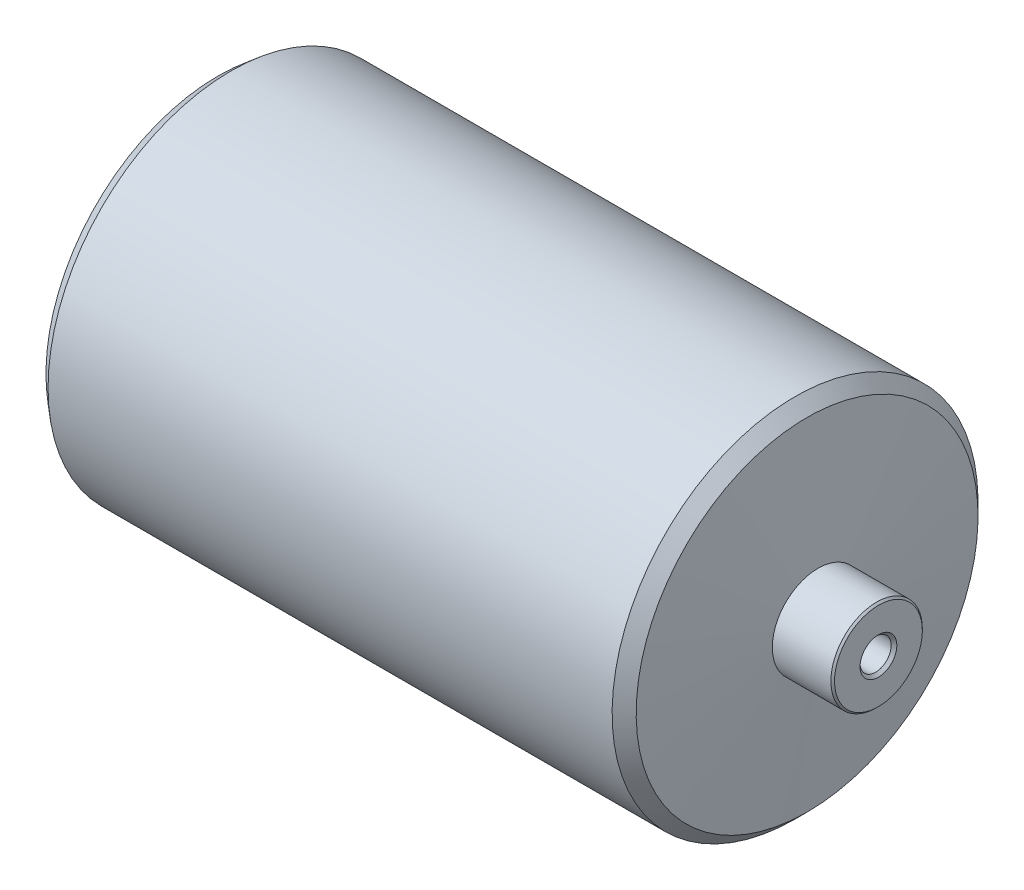
ISO-10303-21;
HEADER;
FILE_DESCRIPTION(('STEP AP214'),'2;1');
FILE_NAME('part.step','',(''),(''),'','','');
FILE_SCHEMA(('AUTOMOTIVE_DESIGN { 1 0 10303 214 1 1 1 1 }'));
ENDSEC;
DATA;
#1=APPLICATION_CONTEXT('core data for automotive mechanical design processes');
#2=APPLICATION_PROTOCOL_DEFINITION('international standard','automotive_design',2000,#1);
#3=PRODUCT_CONTEXT('',#1,'mechanical');
#4=PRODUCT('Part','Part','',(#3));
#5=PRODUCT_RELATED_PRODUCT_CATEGORY('part','',(#4));
#6=PRODUCT_DEFINITION_FORMATION('','',#4);
#7=PRODUCT_DEFINITION_CONTEXT('part definition',#1,'design');
#8=PRODUCT_DEFINITION('design','',#6,#7);
#9=PRODUCT_DEFINITION_SHAPE('','',#8);
#10=(LENGTH_UNIT() NAMED_UNIT(*) SI_UNIT(.MILLI.,.METRE.));
#11=(NAMED_UNIT(*) PLANE_ANGLE_UNIT() SI_UNIT($,.RADIAN.));
#12=(NAMED_UNIT(*) SI_UNIT($,.STERADIAN.) SOLID_ANGLE_UNIT());
#13=UNCERTAINTY_MEASURE_WITH_UNIT(LENGTH_MEASURE(1.E-05),#10,'distance_accuracy_value','');
#14=(GEOMETRIC_REPRESENTATION_CONTEXT(3) GLOBAL_UNCERTAINTY_ASSIGNED_CONTEXT((#13)) GLOBAL_UNIT_ASSIGNED_CONTEXT((#10,
#11,#12)) REPRESENTATION_CONTEXT('',''));
#15=CARTESIAN_POINT('',(0.,0.,0.));
#16=DIRECTION('',(0.,0.,1.));
#17=DIRECTION('',(1.,0.,0.));
#18=AXIS2_PLACEMENT_3D('',#15,#16,#17);
#19=CARTESIAN_POINT('',(-100.,0.,0.));
#20=DIRECTION('',(-1.,0.,0.));
#21=DIRECTION('',(0.,-1.,0.));
#22=AXIS2_PLACEMENT_3D('',#19,#20,#21);
#23=PLANE('',#22);
#24=CARTESIAN_POINT('',(-100.,0.,0.));
#25=DIRECTION('',(-1.,0.,0.));
#26=DIRECTION('',(0.,0.,1.));
#27=AXIS2_PLACEMENT_3D('',#24,#25,#26);
#28=CIRCLE('',#27,5.025);
#29=CARTESIAN_POINT('',(-100.,0.,5.025));
#30=VERTEX_POINT('',#29);
#31=EDGE_CURVE('E83',#30,#30,#28,.T.);
#32=ORIENTED_EDGE('',*,*,#31,.F.);
#33=EDGE_LOOP('',(#32));
#34=FACE_BOUND('',#33,.T.);
#35=CARTESIAN_POINT('',(-100.,0.,0.));
#36=DIRECTION('',(-1.,0.,0.));
#37=DIRECTION('',(0.,-1.,0.));
#38=AXIS2_PLACEMENT_3D('',#35,#36,#37);
#39=CIRCLE('',#38,12.);
#40=CARTESIAN_POINT('',(-100.,-12.,0.));
#41=VERTEX_POINT('',#40);
#42=EDGE_CURVE('E106',#41,#41,#39,.T.);
#43=ORIENTED_EDGE('',*,*,#42,.T.);
#44=EDGE_LOOP('',(#43));
#45=FACE_BOUND('',#44,.T.);
#46=ADVANCED_FACE('F47',(#34,#45),#23,.T.);
#47=CARTESIAN_POINT('',(100.,0.,0.));
#48=DIRECTION('',(1.,0.,0.));
#49=DIRECTION('',(0.,1.,0.));
#50=AXIS2_PLACEMENT_3D('',#47,#48,#49);
#51=CYLINDRICAL_SURFACE('',#50,12.5);
#52=CARTESIAN_POINT('',(-99.4999999999999,0.,0.));
#53=DIRECTION('',(-1.,0.,0.));
#54=DIRECTION('',(0.,-1.,0.));
#55=AXIS2_PLACEMENT_3D('',#52,#53,#54);
#56=CIRCLE('',#55,12.5);
#57=CARTESIAN_POINT('',(-99.4999999999999,-12.5000000000001,0.));
#58=VERTEX_POINT('',#57);
#59=EDGE_CURVE('E102',#58,#58,#56,.F.);
#60=ORIENTED_EDGE('',*,*,#59,.T.);
#61=EDGE_LOOP('',(#60));
#62=FACE_BOUND('',#61,.T.);
#63=CARTESIAN_POINT('',(-83.5,0.,0.));
#64=DIRECTION('',(1.,0.,0.));
#65=DIRECTION('',(0.,1.,0.));
#66=AXIS2_PLACEMENT_3D('',#63,#64,#65);
#67=CIRCLE('',#66,12.5);
#68=CARTESIAN_POINT('',(-83.5,12.4999999999999,0.));
#69=VERTEX_POINT('',#68);
#70=EDGE_CURVE('E98',#69,#69,#67,.T.);
#71=ORIENTED_EDGE('',*,*,#70,.F.);
#72=EDGE_LOOP('',(#71));
#73=FACE_BOUND('',#72,.T.);
#74=ADVANCED_FACE('F145',(#62,#73),#51,.T.);
#75=CARTESIAN_POINT('',(-80.219175117778,0.,0.));
#76=DIRECTION('',(1.,0.,0.));
#77=DIRECTION('',(0.,1.,0.));
#78=AXIS2_PLACEMENT_3D('',#75,#76,#77);
#79=CONICAL_SURFACE('',#78,50.,1.48352986419518);
#80=CARTESIAN_POINT('',(-80.480642346021,0.,0.));
#81=DIRECTION('',(-1.,0.,0.));
#82=DIRECTION('',(0.,-1.,0.));
#83=AXIS2_PLACEMENT_3D('',#80,#81,#82);
#84=CIRCLE('',#83,47.0114159057248);
#85=CARTESIAN_POINT('',(-80.480642346021,47.0114159057246,0.));
#86=VERTEX_POINT('',#85);
#87=EDGE_CURVE('E114',#86,#86,#84,.T.);
#88=CARTESIAN_POINT('',(-80.480642346021,47.0114159057246,0.));
#89=CARTESIAN_POINT('',(-80.5120939882499,46.65192199004,0.));
#90=CARTESIAN_POINT('',(-80.5435456304789,46.2924280743554,0.));
#91=CARTESIAN_POINT('',(-80.6064489149368,45.5734402429861,0.));
#92=CARTESIAN_POINT('',(-80.6379005571657,45.2139463273015,0.));
#93=CARTESIAN_POINT('',(-80.7008038416236,44.4949584959322,0.));
#94=CARTESIAN_POINT('',(-80.7322554838526,44.1354645802476,0.));
#95=CARTESIAN_POINT('',(-80.7951587683105,43.4164767488783,0.));
#96=CARTESIAN_POINT('',(-80.8266104105394,43.0569828331937,0.));
#97=CARTESIAN_POINT('',(-80.8895136949973,42.3379950018244,0.));
#98=CARTESIAN_POINT('',(-80.9209653372263,41.9785010861398,0.));
#99=CARTESIAN_POINT('',(-80.9838686216842,41.2595132547705,0.));
#100=CARTESIAN_POINT('',(-81.0153202639131,40.9000193390859,0.));
#101=CARTESIAN_POINT('',(-81.078223548371,40.1810315077166,0.));
#102=CARTESIAN_POINT('',(-81.1096751905999,39.821537592032,0.));
#103=CARTESIAN_POINT('',(-81.1725784750578,39.1025497606627,0.));
#104=CARTESIAN_POINT('',(-81.2040301172868,38.7430558449781,0.));
#105=CARTESIAN_POINT('',(-81.2669334017447,38.0240680136088,0.));
#106=CARTESIAN_POINT('',(-81.2983850439736,37.6645740979242,0.));
#107=CARTESIAN_POINT('',(-81.3612883284316,36.9455862665549,0.));
#108=CARTESIAN_POINT('',(-81.3927399706605,36.5860923508703,0.));
#109=CARTESIAN_POINT('',(-81.4556432551184,35.867104519501,0.));
#110=CARTESIAN_POINT('',(-81.4870948973473,35.5076106038164,0.));
#111=CARTESIAN_POINT('',(-81.5499981818052,34.7886227724471,0.));
#112=CARTESIAN_POINT('',(-81.5814498240342,34.4291288567625,0.));
#113=CARTESIAN_POINT('',(-81.6443531084921,33.7101410253932,0.));
#114=CARTESIAN_POINT('',(-81.675804750721,33.3506471097086,0.));
#115=CARTESIAN_POINT('',(-81.7387080351789,32.6316592783393,0.));
#116=CARTESIAN_POINT('',(-81.7701596774079,32.2721653626547,0.));
#117=CARTESIAN_POINT('',(-81.8330629618658,31.5531775312854,0.));
#118=CARTESIAN_POINT('',(-81.8645146040947,31.1936836156008,0.));
#119=CARTESIAN_POINT('',(-81.9274178885526,30.4746957842315,0.));
#120=CARTESIAN_POINT('',(-81.9588695307815,30.1152018685469,0.));
#121=CARTESIAN_POINT('',(-82.0217728152395,29.3962140371776,0.));
#122=CARTESIAN_POINT('',(-82.0532244574684,29.036720121493,0.));
#123=CARTESIAN_POINT('',(-82.1161277419263,28.3177322901238,0.));
#124=CARTESIAN_POINT('',(-82.1475793841553,27.9582383744391,0.));
#125=CARTESIAN_POINT('',(-82.2104826686132,27.2392505430699,0.));
#126=CARTESIAN_POINT('',(-82.2419343108421,26.8797566273852,0.));
#127=CARTESIAN_POINT('',(-82.3048375953,26.160768796016,0.));
#128=CARTESIAN_POINT('',(-82.3362892375289,25.8012748803313,0.));
#129=CARTESIAN_POINT('',(-82.3991925219868,25.0822870489621,0.));
#130=CARTESIAN_POINT('',(-82.4306441642158,24.7227931332774,0.));
#131=CARTESIAN_POINT('',(-82.4935474486737,24.0038053019082,0.));
#132=CARTESIAN_POINT('',(-82.5249990909026,23.6443113862235,0.));
#133=CARTESIAN_POINT('',(-82.5879023753605,22.9253235548543,0.));
#134=CARTESIAN_POINT('',(-82.6193540175895,22.5658296391696,0.));
#135=CARTESIAN_POINT('',(-82.6822573020474,21.8468418078004,0.));
#136=CARTESIAN_POINT('',(-82.7137089442763,21.4873478921157,0.));
#137=CARTESIAN_POINT('',(-82.7766122287342,20.7683600607465,0.));
#138=CARTESIAN_POINT('',(-82.8080638709632,20.4088661450618,0.));
#139=CARTESIAN_POINT('',(-82.8709671554211,19.6898783136926,0.));
#140=CARTESIAN_POINT('',(-82.90241879765,19.3303843980079,0.));
#141=CARTESIAN_POINT('',(-82.9653220821079,18.6113965666387,0.));
#142=CARTESIAN_POINT('',(-82.9967737243368,18.251902650954,0.));
#143=CARTESIAN_POINT('',(-83.0596770087948,17.5329148195848,0.));
#144=CARTESIAN_POINT('',(-83.0911286510237,17.1734209039001,0.));
#145=CARTESIAN_POINT('',(-83.1540319354816,16.4544330725309,0.));
#146=CARTESIAN_POINT('',(-83.1854835777105,16.0949391568462,0.));
#147=CARTESIAN_POINT('',(-83.2483868621684,15.375951325477,0.));
#148=CARTESIAN_POINT('',(-83.2798385043974,15.0164574097924,0.));
#149=CARTESIAN_POINT('',(-83.3427417888553,14.2974695784231,0.));
#150=CARTESIAN_POINT('',(-83.3741934310842,13.9379756627385,0.));
#151=CARTESIAN_POINT('',(-83.4370967155421,13.2189878313692,0.));
#152=CARTESIAN_POINT('',(-83.4685483577711,12.8594939156846,0.));
#153=CARTESIAN_POINT('',(-83.5,12.4999999999999,0.));
#154=B_SPLINE_CURVE_WITH_KNOTS('',3,(#88,#89,#90,#91,#92,#93,#94,#95,#96,#97,#98,#99,#100,#101,
#102,#103,#104,#105,#106,#107,#108,#109,#110,#111,#112,#113,#114,#115,#116,#117,#118,#119,#120,
#121,#122,#123,#124,#125,#126,#127,#128,#129,#130,#131,#132,#133,#134,#135,#136,#137,#138,#139,
#140,#141,#142,#143,#144,#145,#146,#147,#148,#149,#150,#151,#152,#153),.UNSPECIFIED.,.F.,.F.,(4,
2,2,2,2,2,2,2,2,2,2,2,2,2,2,2,2,2,2,2,2,2,2,2,2,2,2,2,2,2,2,2,4),(0.,1.08260137212111,
2.16520274424222,3.24780411636333,4.33040548848443,5.41300686060554,6.49560823272665,
7.57820960484776,8.66081097696887,9.74341234908997,10.8260137212111,11.9086150933322,
12.9912164654533,14.0738178375744,15.1564192096955,16.2390205818166,17.3216219539377,
18.4042233260588,19.4868246981799,20.5694260703011,21.6520274424222,22.7346288145433,
23.8172301866644,24.8998315587855,25.9824329309066,27.0650343030277,28.1476356751488,
29.2302370472699,30.312838419391,31.3954397915121,32.4780411636332,33.5606425357543,
34.6432439078755),.UNSPECIFIED.);
#155=EDGE_CURVE('BSEAM151',#86,#69,#154,.T.);
#156=ORIENTED_EDGE('',*,*,#87,.T.);
#157=ORIENTED_EDGE('',*,*,#70,.T.);
#158=ORIENTED_EDGE('',*,*,#155,.T.);
#159=ORIENTED_EDGE('',*,*,#155,.F.);
#160=EDGE_LOOP('',(#156,#158,#157,#159));
#161=FACE_BOUND('',#160,.T.);
#162=ADVANCED_FACE('F151',(#161),#79,.T.);
#163=CARTESIAN_POINT('',(100.,0.,0.));
#164=DIRECTION('',(1.,0.,0.));
#165=DIRECTION('',(0.,1.,0.));
#166=AXIS2_PLACEMENT_3D('',#163,#164,#165);
#167=CYLINDRICAL_SURFACE('',#166,50.);
#168=CARTESIAN_POINT('',(77.2191751177779,0.,0.));
#169=DIRECTION('',(1.,0.,0.));
#170=DIRECTION('',(0.,1.,0.));
#171=AXIS2_PLACEMENT_3D('',#168,#169,#170);
#172=CIRCLE('',#171,50.);
#173=CARTESIAN_POINT('',(77.2191751177779,-50.0000000000001,0.));
#174=VERTEX_POINT('',#173);
#175=EDGE_CURVE('E122',#174,#174,#172,.F.);
#176=ORIENTED_EDGE('',*,*,#175,.T.);
#177=EDGE_LOOP('',(#176));
#178=FACE_BOUND('',#177,.T.);
#179=CARTESIAN_POINT('',(-76.9189865148986,0.,0.));
#180=DIRECTION('',(-1.,0.,0.));
#181=DIRECTION('',(0.,-1.,0.));
#182=AXIS2_PLACEMENT_3D('',#179,#180,#181);
#183=CIRCLE('',#182,50.);
#184=CARTESIAN_POINT('',(-76.9189865148986,-50.0000000000001,0.));
#185=VERTEX_POINT('',#184);
#186=EDGE_CURVE('E110',#185,#185,#183,.F.);
#187=ORIENTED_EDGE('',*,*,#186,.T.);
#188=EDGE_LOOP('',(#187));
#189=FACE_BOUND('',#188,.T.);
#190=ADVANCED_FACE('F181',(#178,#189),#167,.T.);
#191=CARTESIAN_POINT('',(83.5,0.,0.));
#192=DIRECTION('',(-1.,0.,0.));
#193=DIRECTION('',(0.,-1.,0.));
#194=AXIS2_PLACEMENT_3D('',#191,#192,#193);
#195=CONICAL_SURFACE('',#194,12.5000000000003,1.48352986419518);
#196=CARTESIAN_POINT('',(80.5068055066693,0.,0.));
#197=DIRECTION('',(1.,0.,0.));
#198=DIRECTION('',(0.,1.,0.));
#199=AXIS2_PLACEMENT_3D('',#196,#197,#198);
#200=CIRCLE('',#199,46.7123696111087);
#201=CARTESIAN_POINT('',(80.5068055066693,-46.7123696111086,0.));
#202=VERTEX_POINT('',#201);
#203=EDGE_CURVE('E118',#202,#202,#200,.T.);
#204=CARTESIAN_POINT('',(83.5,0.,0.));
#205=DIRECTION('',(1.,0.,0.));
#206=DIRECTION('',(0.,1.,0.));
#207=AXIS2_PLACEMENT_3D('',#204,#205,#206);
#208=CIRCLE('',#207,12.5000000000003);
#209=CARTESIAN_POINT('',(83.5,-12.5000000000002,0.));
#210=VERTEX_POINT('',#209);
#211=EDGE_CURVE('E94',#210,#210,#208,.T.);
#212=CARTESIAN_POINT('',(80.5068055066693,-46.7123696111086,0.));
#213=CARTESIAN_POINT('',(80.5379846159748,-46.3559907609929,0.));
#214=CARTESIAN_POINT('',(80.5691637252804,-45.9996119108772,0.));
#215=CARTESIAN_POINT('',(80.6315219438914,-45.2868542106457,0.));
#216=CARTESIAN_POINT('',(80.662701053197,-44.93047536053,0.));
#217=CARTESIAN_POINT('',(80.725059271808,-44.2177176602986,0.));
#218=CARTESIAN_POINT('',(80.7562383811135,-43.8613388101829,0.));
#219=CARTESIAN_POINT('',(80.8185965997246,-43.1485811099515,0.));
#220=CARTESIAN_POINT('',(80.8497757090301,-42.7922022598357,0.));
#221=CARTESIAN_POINT('',(80.9121339276412,-42.0794445596043,0.));
#222=CARTESIAN_POINT('',(80.9433130369467,-41.7230657094886,0.));
#223=CARTESIAN_POINT('',(81.0056712555578,-41.0103080092572,0.));
#224=CARTESIAN_POINT('',(81.0368503648633,-40.6539291591415,0.));
#225=CARTESIAN_POINT('',(81.0992085834744,-39.94117145891,0.));
#226=CARTESIAN_POINT('',(81.1303876927799,-39.5847926087943,0.));
#227=CARTESIAN_POINT('',(81.1927459113909,-38.8720349085629,0.));
#228=CARTESIAN_POINT('',(81.2239250206965,-38.5156560584472,0.));
#229=CARTESIAN_POINT('',(81.2862832393075,-37.8028983582158,0.));
#230=CARTESIAN_POINT('',(81.317462348613,-37.4465195081001,0.));
#231=CARTESIAN_POINT('',(81.3798205672241,-36.7337618078686,0.));
#232=CARTESIAN_POINT('',(81.4109996765296,-36.3773829577529,0.));
#233=CARTESIAN_POINT('',(81.4733578951407,-35.6646252575215,0.));
#234=CARTESIAN_POINT('',(81.5045370044462,-35.3082464074058,0.));
#235=CARTESIAN_POINT('',(81.5668952230573,-34.5954887071744,0.));
#236=CARTESIAN_POINT('',(81.5980743323628,-34.2391098570587,0.));
#237=CARTESIAN_POINT('',(81.6604325509739,-33.5263521568272,0.));
#238=CARTESIAN_POINT('',(81.6916116602794,-33.1699733067115,0.));
#239=CARTESIAN_POINT('',(81.7539698788904,-32.4572156064801,0.));
#240=CARTESIAN_POINT('',(81.785148988196,-32.1008367563644,0.));
#241=CARTESIAN_POINT('',(81.847507206807,-31.388079056133,0.));
#242=CARTESIAN_POINT('',(81.8786863161126,-31.0317002060172,0.));
#243=CARTESIAN_POINT('',(81.9410445347236,-30.3189425057858,0.));
#244=CARTESIAN_POINT('',(81.9722236440291,-29.9625636556701,0.));
#245=CARTESIAN_POINT('',(82.0345818626402,-29.2498059554387,0.));
#246=CARTESIAN_POINT('',(82.0657609719457,-28.893427105323,0.));
#247=CARTESIAN_POINT('',(82.1281191905568,-28.1806694050915,0.));
#248=CARTESIAN_POINT('',(82.1592982998623,-27.8242905549758,0.));
#249=CARTESIAN_POINT('',(82.2216565184734,-27.1115328547444,0.));
#250=CARTESIAN_POINT('',(82.2528356277789,-26.7551540046287,0.));
#251=CARTESIAN_POINT('',(82.31519384639,-26.0423963043973,0.));
#252=CARTESIAN_POINT('',(82.3463729556955,-25.6860174542816,0.));
#253=CARTESIAN_POINT('',(82.4087311743065,-24.9732597540501,0.));
#254=CARTESIAN_POINT('',(82.4399102836121,-24.6168809039344,0.));
#255=CARTESIAN_POINT('',(82.5022685022231,-23.904123203703,0.));
#256=CARTESIAN_POINT('',(82.5334476115286,-23.5477443535873,0.));
#257=CARTESIAN_POINT('',(82.5958058301397,-22.8349866533559,0.));
#258=CARTESIAN_POINT('',(82.6269849394452,-22.4786078032401,0.));
#259=CARTESIAN_POINT('',(82.6893431580563,-21.7658501030087,0.));
#260=CARTESIAN_POINT('',(82.7205222673618,-21.409471252893,0.));
#261=CARTESIAN_POINT('',(82.7828804859729,-20.6967135526616,0.));
#262=CARTESIAN_POINT('',(82.8140595952784,-20.3403347025459,0.));
#263=CARTESIAN_POINT('',(82.8764178138895,-19.6275770023144,0.));
#264=CARTESIAN_POINT('',(82.907596923195,-19.2711981521987,0.));
#265=CARTESIAN_POINT('',(82.9699551418061,-18.5584404519673,0.));
#266=CARTESIAN_POINT('',(83.0011342511116,-18.2020616018516,0.));
#267=CARTESIAN_POINT('',(83.0634924697226,-17.4893039016202,0.));
#268=CARTESIAN_POINT('',(83.0946715790282,-17.1329250515045,0.));
#269=CARTESIAN_POINT('',(83.1570297976392,-16.420167351273,0.));
#270=CARTESIAN_POINT('',(83.1882089069447,-16.0637885011573,0.));
#271=CARTESIAN_POINT('',(83.2505671255558,-15.3510308009259,0.));
#272=CARTESIAN_POINT('',(83.2817462348613,-14.9946519508102,0.));
#273=CARTESIAN_POINT('',(83.3441044534724,-14.2818942505788,0.));
#274=CARTESIAN_POINT('',(83.3752835627779,-13.9255154004631,0.));
#275=CARTESIAN_POINT('',(83.437641781389,-13.2127577002316,0.));
#276=CARTESIAN_POINT('',(83.4688208906945,-12.8563788501159,0.));
#277=CARTESIAN_POINT('',(83.5,-12.5000000000002,0.));
#278=B_SPLINE_CURVE_WITH_KNOTS('',3,(#212,#213,#214,#215,#216,#217,#218,#219,#220,#221,#222,
#223,#224,#225,#226,#227,#228,#229,#230,#231,#232,#233,#234,#235,#236,#237,#238,#239,#240,#241,
#242,#243,#244,#245,#246,#247,#248,#249,#250,#251,#252,#253,#254,#255,#256,#257,#258,#259,#260,
#261,#262,#263,#264,#265,#266,#267,#268,#269,#270,#271,#272,#273,#274,#275,#276,#277),
.UNSPECIFIED.,.F.,.F.,(4,2,2,2,2,2,2,2,2,2,2,2,2,2,2,2,2,2,2,2,2,2,2,2,2,2,2,2,2,2,2,2,4),(0.,
1.07322047828111,2.14644095656223,3.21966143484335,4.29288191312447,5.36610239140558,
6.4393228696867,7.51254334796782,8.58576382624893,9.65898430453006,10.7322047828112,
11.8054252610923,12.8786457393734,13.9518662176545,15.0250866959356,16.0983071742168,
17.1715276524979,18.244748130779,19.3179686090601,20.3911890873412,21.4644095656224,
22.5376300439035,23.6108505221846,24.6840710004657,25.7572914787468,26.8305119570279,
27.9037324353091,28.9769529135902,30.0501733918713,31.1233938701524,32.1966143484335,
33.2698348267146,34.3430553049958),.UNSPECIFIED.);
#279=EDGE_CURVE('BSEAM183',#202,#210,#278,.T.);
#280=ORIENTED_EDGE('',*,*,#203,.T.);
#281=ORIENTED_EDGE('',*,*,#211,.F.);
#282=ORIENTED_EDGE('',*,*,#279,.T.);
#283=ORIENTED_EDGE('',*,*,#279,.F.);
#284=EDGE_LOOP('',(#280,#282,#281,#283));
#285=FACE_BOUND('',#284,.T.);
#286=ADVANCED_FACE('F183',(#285),#195,.T.);
#287=CARTESIAN_POINT('',(100.,0.,0.));
#288=DIRECTION('',(1.,0.,0.));
#289=DIRECTION('',(0.,1.,0.));
#290=AXIS2_PLACEMENT_3D('',#287,#288,#289);
#291=CYLINDRICAL_SURFACE('',#290,12.5000000000003);
#292=CARTESIAN_POINT('',(99.5,0.,0.));
#293=DIRECTION('',(1.,0.,0.));
#294=DIRECTION('',(0.,1.,0.));
#295=AXIS2_PLACEMENT_3D('',#292,#293,#294);
#296=CIRCLE('',#295,12.5000000000003);
#297=CARTESIAN_POINT('',(99.5,12.5000000000002,0.));
#298=VERTEX_POINT('',#297);
#299=EDGE_CURVE('E11',#298,#298,#296,.F.);
#300=ORIENTED_EDGE('',*,*,#299,.T.);
#301=EDGE_LOOP('',(#300));
#302=FACE_BOUND('',#301,.T.);
#303=ORIENTED_EDGE('',*,*,#211,.T.);
#304=EDGE_LOOP('',(#303));
#305=FACE_BOUND('',#304,.T.);
#306=ADVANCED_FACE('F190',(#302,#305),#291,.T.);
#307=CARTESIAN_POINT('',(100.,12.5000000000002,0.));
#308=DIRECTION('',(1.,0.,0.));
#309=DIRECTION('',(0.,1.,0.));
#310=AXIS2_PLACEMENT_3D('',#307,#308,#309);
#311=PLANE('',#310);
#312=CARTESIAN_POINT('',(100.,0.,0.));
#313=DIRECTION('',(1.,0.,0.));
#314=DIRECTION('',(0.,0.,-1.));
#315=AXIS2_PLACEMENT_3D('',#312,#313,#314);
#316=CIRCLE('',#315,5.025);
#317=CARTESIAN_POINT('',(100.,0.,-5.025));
#318=VERTEX_POINT('',#317);
#319=EDGE_CURVE('E74',#318,#318,#316,.T.);
#320=ORIENTED_EDGE('',*,*,#319,.F.);
#321=EDGE_LOOP('',(#320));
#322=FACE_BOUND('',#321,.T.);
#323=CARTESIAN_POINT('',(100.,0.,0.));
#324=DIRECTION('',(1.,0.,0.));
#325=DIRECTION('',(0.,1.,0.));
#326=AXIS2_PLACEMENT_3D('',#323,#324,#325);
#327=CIRCLE('',#326,12.0000000000003);
#328=CARTESIAN_POINT('',(100.,12.0000000000002,0.));
#329=VERTEX_POINT('',#328);
#330=EDGE_CURVE('E57',#329,#329,#327,.T.);
#331=ORIENTED_EDGE('',*,*,#330,.T.);
#332=EDGE_LOOP('',(#331));
#333=FACE_BOUND('',#332,.T.);
#334=ADVANCED_FACE('F129',(#322,#333),#311,.T.);
#335=CARTESIAN_POINT('',(-99.4999999999999,0.,0.));
#336=DIRECTION('',(1.,0.,0.));
#337=DIRECTION('',(0.,1.,0.));
#338=AXIS2_PLACEMENT_3D('',#335,#336,#337);
#339=CONICAL_SURFACE('',#338,12.5,0.78539816339746);
#340=ORIENTED_EDGE('',*,*,#42,.F.);
#341=EDGE_LOOP('',(#340));
#342=FACE_BOUND('',#341,.T.);
#343=ORIENTED_EDGE('',*,*,#59,.F.);
#344=EDGE_LOOP('',(#343));
#345=FACE_BOUND('',#344,.T.);
#346=ADVANCED_FACE('F159',(#342,#345),#339,.T.);
#347=CARTESIAN_POINT('',(-76.9189865148985,0.,0.));
#348=DIRECTION('',(1.,0.,0.));
#349=DIRECTION('',(0.,1.,0.));
#350=AXIS2_PLACEMENT_3D('',#347,#348,#349);
#351=CONICAL_SURFACE('',#350,50.,0.698131700797733);
#352=ORIENTED_EDGE('',*,*,#87,.F.);
#353=EDGE_LOOP('',(#352));
#354=FACE_BOUND('',#353,.T.);
#355=ORIENTED_EDGE('',*,*,#186,.F.);
#356=EDGE_LOOP('',(#355));
#357=FACE_BOUND('',#356,.T.);
#358=ADVANCED_FACE('F141',(#354,#357),#351,.T.);
#359=CARTESIAN_POINT('',(80.5068055066693,0.,0.));
#360=DIRECTION('',(-1.,0.,0.));
#361=DIRECTION('',(0.,-1.,0.));
#362=AXIS2_PLACEMENT_3D('',#359,#360,#361);
#363=CONICAL_SURFACE('',#362,46.7123696111087,0.785398163397446);
#364=CARTESIAN_POINT('',(77.2191751177779,-50.0000000000001,0.));
#365=CARTESIAN_POINT('',(77.2534212676622,-49.9657538501158,0.));
#366=CARTESIAN_POINT('',(77.2876674175465,-49.9315077002315,0.));
#367=CARTESIAN_POINT('',(77.3561597173151,-49.8630154004629,0.));
#368=CARTESIAN_POINT('',(77.3904058671994,-49.8287692505787,0.));
#369=CARTESIAN_POINT('',(77.4588981669679,-49.7602769508101,0.));
#370=CARTESIAN_POINT('',(77.4931443168522,-49.7260308009258,0.));
#371=CARTESIAN_POINT('',(77.5616366166208,-49.6575385011572,0.));
#372=CARTESIAN_POINT('',(77.5958827665051,-49.623292351273,0.));
#373=CARTESIAN_POINT('',(77.6643750662736,-49.5548000515044,0.));
#374=CARTESIAN_POINT('',(77.6986212161579,-49.5205539016201,0.));
#375=CARTESIAN_POINT('',(77.7671135159265,-49.4520616018515,0.));
#376=CARTESIAN_POINT('',(77.8013596658108,-49.4178154519672,0.));
#377=CARTESIAN_POINT('',(77.8698519655794,-49.3493231521987,0.));
#378=CARTESIAN_POINT('',(77.9040981154636,-49.3150770023144,0.));
#379=CARTESIAN_POINT('',(77.9725904152322,-49.2465847025458,0.));
#380=CARTESIAN_POINT('',(78.0068365651165,-49.2123385526615,0.));
#381=CARTESIAN_POINT('',(78.0753288648851,-49.143846252893,0.));
#382=CARTESIAN_POINT('',(78.1095750147693,-49.1096001030087,0.));
#383=CARTESIAN_POINT('',(78.1780673145379,-49.0411078032401,0.));
#384=CARTESIAN_POINT('',(78.2123134644222,-49.0068616533558,0.));
#385=CARTESIAN_POINT('',(78.2808057641908,-48.9383693535872,0.));
#386=CARTESIAN_POINT('',(78.3150519140751,-48.904123203703,0.));
#387=CARTESIAN_POINT('',(78.3835442138436,-48.8356309039344,0.));
#388=CARTESIAN_POINT('',(78.4177903637279,-48.8013847540501,0.));
#389=CARTESIAN_POINT('',(78.4862826634965,-48.7328924542815,0.));
#390=CARTESIAN_POINT('',(78.5205288133808,-48.6986463043973,0.));
#391=CARTESIAN_POINT('',(78.5890211131493,-48.6301540046287,0.));
#392=CARTESIAN_POINT('',(78.6232672630336,-48.5959078547444,0.));
#393=CARTESIAN_POINT('',(78.6917595628022,-48.5274155549758,0.));
#394=CARTESIAN_POINT('',(78.7260057126865,-48.4931694050915,0.));
#395=CARTESIAN_POINT('',(78.7944980124551,-48.424677105323,0.));
#396=CARTESIAN_POINT('',(78.8287441623393,-48.3904309554387,0.));
#397=CARTESIAN_POINT('',(78.8972364621079,-48.3219386556701,0.));
#398=CARTESIAN_POINT('',(78.9314826119922,-48.2876925057858,0.));
#399=CARTESIAN_POINT('',(78.9999749117608,-48.2192002060173,0.));
#400=CARTESIAN_POINT('',(79.0342210616451,-48.184954056133,0.));
#401=CARTESIAN_POINT('',(79.1027133614136,-48.1164617563644,0.));
#402=CARTESIAN_POINT('',(79.1369595112979,-48.0822156064801,0.));
#403=CARTESIAN_POINT('',(79.2054518110665,-48.0137233067116,0.));
#404=CARTESIAN_POINT('',(79.2396979609508,-47.9794771568273,0.));
#405=CARTESIAN_POINT('',(79.3081902607193,-47.9109848570587,0.));
#406=CARTESIAN_POINT('',(79.3424364106036,-47.8767387071744,0.));
#407=CARTESIAN_POINT('',(79.4109287103722,-47.8082464074058,0.));
#408=CARTESIAN_POINT('',(79.4451748602565,-47.7740002575216,0.));
#409=CARTESIAN_POINT('',(79.5136671600251,-47.705507957753,0.));
#410=CARTESIAN_POINT('',(79.5479133099093,-47.6712618078687,0.));
#411=CARTESIAN_POINT('',(79.6164056096779,-47.6027695081001,0.));
#412=CARTESIAN_POINT('',(79.6506517595622,-47.5685233582159,0.));
#413=CARTESIAN_POINT('',(79.7191440593308,-47.5000310584473,0.));
#414=CARTESIAN_POINT('',(79.753390209215,-47.465784908563,0.));
#415=CARTESIAN_POINT('',(79.8218825089836,-47.3972926087944,0.));
#416=CARTESIAN_POINT('',(79.8561286588679,-47.3630464589101,0.));
#417=CARTESIAN_POINT('',(79.9246209586365,-47.2945541591416,0.));
#418=CARTESIAN_POINT('',(79.9588671085207,-47.2603080092573,0.));
#419=CARTESIAN_POINT('',(80.0273594082893,-47.1918157094887,0.));
#420=CARTESIAN_POINT('',(80.0616055581736,-47.1575695596044,0.));
#421=CARTESIAN_POINT('',(80.1300978579422,-47.0890772598359,0.));
#422=CARTESIAN_POINT('',(80.1643440078265,-47.0548311099516,0.));
#423=CARTESIAN_POINT('',(80.232836307595,-46.986338810183,0.));
#424=CARTESIAN_POINT('',(80.2670824574793,-46.9520926602987,0.));
#425=CARTESIAN_POINT('',(80.3355747572479,-46.8836003605301,0.));
#426=CARTESIAN_POINT('',(80.3698209071322,-46.8493542106459,0.));
#427=CARTESIAN_POINT('',(80.4383132069007,-46.7808619108773,0.));
#428=CARTESIAN_POINT('',(80.472559356785,-46.746615760993,0.));
#429=CARTESIAN_POINT('',(80.5068055066693,-46.7123696111087,0.));
#430=B_SPLINE_CURVE_WITH_KNOTS('',3,(#364,#365,#366,#367,#368,#369,#370,#371,#372,#373,#374,
#375,#376,#377,#378,#379,#380,#381,#382,#383,#384,#385,#386,#387,#388,#389,#390,#391,#392,#393,
#394,#395,#396,#397,#398,#399,#400,#401,#402,#403,#404,#405,#406,#407,#408,#409,#410,#411,#412,
#413,#414,#415,#416,#417,#418,#419,#420,#421,#422,#423,#424,#425,#426,#427,#428,#429),
.UNSPECIFIED.,.F.,.F.,(4,2,2,2,2,2,2,2,2,2,2,2,2,2,2,2,2,2,2,2,2,2,2,2,2,2,2,2,2,2,2,2,4),(0.,
0.145294108876248,0.290588217752505,0.435882326628752,0.58117643550501,0.726470544381257,
0.871764653257515,1.01705876213376,1.16235287101002,1.30764697988628,1.45294108876253,
1.59823519763879,1.74352930651503,1.88882341539129,2.03411752426754,2.1794116331438,
2.32470574202005,2.4699998508963,2.61529395977256,2.76058806864881,2.90588217752506,
3.05117628640131,3.19647039527757,3.34176450415382,3.48705861303007,3.63235272190634,
3.77764683078258,3.92294093965884,4.06823504853509,4.21352915741135,4.35882326628759,
4.50411737516385,4.6494114840401),.UNSPECIFIED.);
#431=EDGE_CURVE('BSEAM133',#174,#202,#430,.T.);
#432=ORIENTED_EDGE('',*,*,#175,.F.);
#433=ORIENTED_EDGE('',*,*,#203,.F.);
#434=ORIENTED_EDGE('',*,*,#431,.T.);
#435=ORIENTED_EDGE('',*,*,#431,.F.);
#436=EDGE_LOOP('',(#432,#434,#433,#435));
#437=FACE_BOUND('',#436,.T.);
#438=ADVANCED_FACE('F133',(#437),#363,.T.);
#439=CARTESIAN_POINT('',(100.,0.,0.));
#440=DIRECTION('',(-1.,0.,0.));
#441=DIRECTION('',(0.,-1.,0.));
#442=AXIS2_PLACEMENT_3D('',#439,#440,#441);
#443=CONICAL_SURFACE('',#442,12.0000000000003,0.785398163397459);
#444=ORIENTED_EDGE('',*,*,#299,.F.);
#445=EDGE_LOOP('',(#444));
#446=FACE_BOUND('',#445,.T.);
#447=ORIENTED_EDGE('',*,*,#330,.F.);
#448=EDGE_LOOP('',(#447));
#449=FACE_BOUND('',#448,.T.);
#450=ADVANCED_FACE('F50',(#446,#449),#443,.T.);
#451=CARTESIAN_POINT('',(43.5536576308671,0.,0.));
#452=DIRECTION('',(1.,0.,0.));
#453=DIRECTION('',(0.,0.,-1.));
#454=AXIS2_PLACEMENT_3D('',#451,#452,#453);
#455=CONICAL_SURFACE('',#454,4.24999999999999,1.02974425867665);
#456=CARTESIAN_POINT('',(41.,0.,0.));
#457=VERTEX_POINT('',#456);
#458=VERTEX_LOOP('',#457);
#459=FACE_BOUND('',#458,.T.);
#460=CARTESIAN_POINT('',(43.5536576308671,0.,0.));
#461=DIRECTION('',(1.,0.,0.));
#462=DIRECTION('',(0.,0.,-1.));
#463=AXIS2_PLACEMENT_3D('',#460,#461,#462);
#464=CIRCLE('',#463,4.24999999999999);
#465=CARTESIAN_POINT('',(43.5536576308671,0.,-4.24999999999999));
#466=VERTEX_POINT('',#465);
#467=EDGE_CURVE('E90',#466,#466,#464,.T.);
#468=ORIENTED_EDGE('',*,*,#467,.T.);
#469=EDGE_LOOP('',(#468));
#470=FACE_BOUND('',#469,.T.);
#471=ADVANCED_FACE('F132',(#459,#470),#455,.F.);
#472=CARTESIAN_POINT('',(100.,0.,0.));
#473=DIRECTION('',(1.,0.,0.));
#474=DIRECTION('',(0.,0.,-1.));
#475=AXIS2_PLACEMENT_3D('',#472,#473,#474);
#476=CYLINDRICAL_SURFACE('',#475,4.24999999999999);
#477=ORIENTED_EDGE('',*,*,#467,.F.);
#478=EDGE_LOOP('',(#477));
#479=FACE_BOUND('',#478,.T.);
#480=CARTESIAN_POINT('',(99.225,0.,0.));
#481=DIRECTION('',(1.,0.,0.));
#482=DIRECTION('',(0.,0.,-1.));
#483=AXIS2_PLACEMENT_3D('',#480,#481,#482);
#484=CIRCLE('',#483,4.25);
#485=CARTESIAN_POINT('',(99.225,0.,-4.25));
#486=VERTEX_POINT('',#485);
#487=EDGE_CURVE('E80',#486,#486,#484,.T.);
#488=ORIENTED_EDGE('',*,*,#487,.T.);
#489=EDGE_LOOP('',(#488));
#490=FACE_BOUND('',#489,.T.);
#491=ADVANCED_FACE('F139',(#479,#490),#476,.F.);
#492=CARTESIAN_POINT('',(100.,0.,0.));
#493=DIRECTION('',(1.,0.,0.));
#494=DIRECTION('',(0.,0.,-1.));
#495=AXIS2_PLACEMENT_3D('',#492,#493,#494);
#496=CONICAL_SURFACE('',#495,5.025,0.785398163397452);
#497=ORIENTED_EDGE('',*,*,#487,.F.);
#498=EDGE_LOOP('',(#497));
#499=FACE_BOUND('',#498,.T.);
#500=ORIENTED_EDGE('',*,*,#319,.T.);
#501=EDGE_LOOP('',(#500));
#502=FACE_BOUND('',#501,.T.);
#503=ADVANCED_FACE('F67',(#499,#502),#496,.F.);
#504=CARTESIAN_POINT('',(-43.5536576308671,0.,0.));
#505=DIRECTION('',(-1.,0.,0.));
#506=DIRECTION('',(0.,0.,1.));
#507=AXIS2_PLACEMENT_3D('',#504,#505,#506);
#508=CONICAL_SURFACE('',#507,4.24999999999999,1.02974425867665);
#509=CARTESIAN_POINT('',(-41.,0.,0.));
#510=VERTEX_POINT('',#509);
#511=VERTEX_LOOP('',#510);
#512=FACE_BOUND('',#511,.T.);
#513=CARTESIAN_POINT('',(-43.5536576308671,0.,0.));
#514=DIRECTION('',(-1.,0.,0.));
#515=DIRECTION('',(0.,0.,1.));
#516=AXIS2_PLACEMENT_3D('',#513,#514,#515);
#517=CIRCLE('',#516,4.24999999999999);
#518=CARTESIAN_POINT('',(-43.5536576308671,0.,4.24999999999999));
#519=VERTEX_POINT('',#518);
#520=EDGE_CURVE('E71',#519,#519,#517,.T.);
#521=ORIENTED_EDGE('',*,*,#520,.T.);
#522=EDGE_LOOP('',(#521));
#523=FACE_BOUND('',#522,.T.);
#524=ADVANCED_FACE('F63',(#512,#523),#508,.F.);
#525=CARTESIAN_POINT('',(-100.,0.,0.));
#526=DIRECTION('',(-1.,0.,0.));
#527=DIRECTION('',(0.,0.,1.));
#528=AXIS2_PLACEMENT_3D('',#525,#526,#527);
#529=CYLINDRICAL_SURFACE('',#528,4.24999999999999);
#530=ORIENTED_EDGE('',*,*,#520,.F.);
#531=EDGE_LOOP('',(#530));
#532=FACE_BOUND('',#531,.T.);
#533=CARTESIAN_POINT('',(-99.225,0.,0.));
#534=DIRECTION('',(-1.,0.,0.));
#535=DIRECTION('',(0.,0.,1.));
#536=AXIS2_PLACEMENT_3D('',#533,#534,#535);
#537=CIRCLE('',#536,4.24999999999999);
#538=CARTESIAN_POINT('',(-99.225,0.,4.24999999999999));
#539=VERTEX_POINT('',#538);
#540=EDGE_CURVE('E75',#539,#539,#537,.T.);
#541=ORIENTED_EDGE('',*,*,#540,.T.);
#542=EDGE_LOOP('',(#541));
#543=FACE_BOUND('',#542,.T.);
#544=ADVANCED_FACE('F66',(#532,#543),#529,.F.);
#545=CARTESIAN_POINT('',(-100.,0.,0.));
#546=DIRECTION('',(-1.,0.,0.));
#547=DIRECTION('',(0.,0.,1.));
#548=AXIS2_PLACEMENT_3D('',#545,#546,#547);
#549=CONICAL_SURFACE('',#548,5.025,0.785398163397449);
#550=ORIENTED_EDGE('',*,*,#540,.F.);
#551=EDGE_LOOP('',(#550));
#552=FACE_BOUND('',#551,.T.);
#553=ORIENTED_EDGE('',*,*,#31,.T.);
#554=EDGE_LOOP('',(#553));
#555=FACE_BOUND('',#554,.T.);
#556=ADVANCED_FACE('F209',(#552,#555),#549,.F.);
#557=CLOSED_SHELL('',(#46,#74,#162,#190,#286,#306,#334,#346,#358,#438,#450,#471,#491,#503,#524,
#544,#556));
#558=MANIFOLD_SOLID_BREP('B2',#557);
#559=ADVANCED_BREP_SHAPE_REPRESENTATION('',(#18,#558),#14);
#560=SHAPE_DEFINITION_REPRESENTATION(#9,#559);
ENDSEC;
END-ISO-10303-21;
